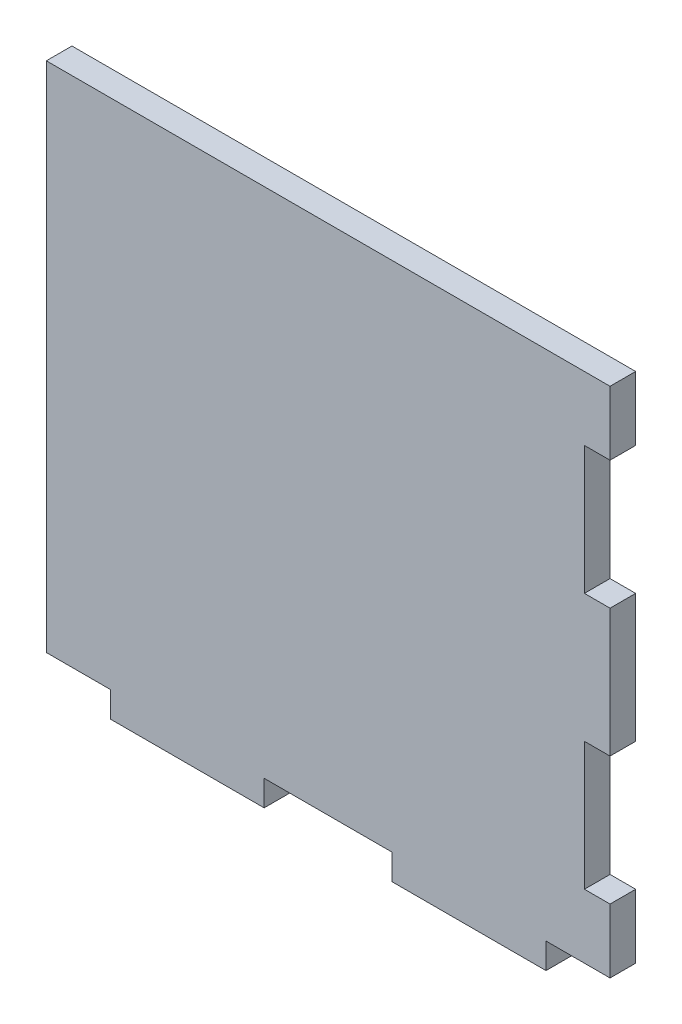
ISO-10303-21;
HEADER;
FILE_DESCRIPTION(('STEP AP214'),'2;1');
FILE_NAME('part.step','',(''),(''),'','','');
FILE_SCHEMA(('AUTOMOTIVE_DESIGN { 1 0 10303 214 1 1 1 1 }'));
ENDSEC;
DATA;
#1=APPLICATION_CONTEXT('core data for automotive mechanical design processes');
#2=APPLICATION_PROTOCOL_DEFINITION('international standard','automotive_design',2000,#1);
#3=PRODUCT_CONTEXT('',#1,'mechanical');
#4=PRODUCT('Part','Part','',(#3));
#5=PRODUCT_RELATED_PRODUCT_CATEGORY('part','',(#4));
#6=PRODUCT_DEFINITION_FORMATION('','',#4);
#7=PRODUCT_DEFINITION_CONTEXT('part definition',#1,'design');
#8=PRODUCT_DEFINITION('design','',#6,#7);
#9=PRODUCT_DEFINITION_SHAPE('','',#8);
#10=(LENGTH_UNIT() NAMED_UNIT(*) SI_UNIT(.MILLI.,.METRE.));
#11=(NAMED_UNIT(*) PLANE_ANGLE_UNIT() SI_UNIT($,.RADIAN.));
#12=(NAMED_UNIT(*) SI_UNIT($,.STERADIAN.) SOLID_ANGLE_UNIT());
#13=UNCERTAINTY_MEASURE_WITH_UNIT(LENGTH_MEASURE(1.E-05),#10,'distance_accuracy_value','');
#14=(GEOMETRIC_REPRESENTATION_CONTEXT(3) GLOBAL_UNCERTAINTY_ASSIGNED_CONTEXT((#13)) GLOBAL_UNIT_ASSIGNED_CONTEXT((#10,
#11,#12)) REPRESENTATION_CONTEXT('',''));
#15=CARTESIAN_POINT('',(0.,0.,0.));
#16=DIRECTION('',(0.,0.,1.));
#17=DIRECTION('',(1.,0.,0.));
#18=AXIS2_PLACEMENT_3D('',#15,#16,#17);
#19=CARTESIAN_POINT('',(110.,0.,5.));
#20=DIRECTION('',(-1.,0.,0.));
#21=DIRECTION('',(0.,0.,1.));
#22=AXIS2_PLACEMENT_3D('',#19,#20,#21);
#23=PLANE('',#22);
#24=DIRECTION('',(0.,1.,0.));
#25=VECTOR('',#24,1.);
#26=CARTESIAN_POINT('',(110.,0.,0.));
#27=LINE('',#26,#25);
#28=CARTESIAN_POINT('',(110.,37.5,0.));
#29=VERTEX_POINT('',#28);
#30=CARTESIAN_POINT('',(110.,62.5,0.));
#31=VERTEX_POINT('',#30);
#32=EDGE_CURVE('E194',#29,#31,#27,.T.);
#33=ORIENTED_EDGE('',*,*,#32,.T.);
#34=DIRECTION('',(0.,0.,1.));
#35=VECTOR('',#34,1.);
#36=CARTESIAN_POINT('',(110.,62.5,0.));
#37=LINE('',#36,#35);
#38=CARTESIAN_POINT('',(110.,62.5,5.));
#39=VERTEX_POINT('',#38);
#40=EDGE_CURVE('E330',#31,#39,#37,.T.);
#41=ORIENTED_EDGE('',*,*,#40,.T.);
#42=DIRECTION('',(0.,1.,0.));
#43=VECTOR('',#42,1.);
#44=CARTESIAN_POINT('',(110.,0.,5.));
#45=LINE('',#44,#43);
#46=CARTESIAN_POINT('',(110.,37.5,5.));
#47=VERTEX_POINT('',#46);
#48=EDGE_CURVE('E328',#47,#39,#45,.T.);
#49=ORIENTED_EDGE('',*,*,#48,.F.);
#50=DIRECTION('',(0.,0.,1.));
#51=VECTOR('',#50,1.);
#52=CARTESIAN_POINT('',(110.,37.5,0.));
#53=LINE('',#52,#51);
#54=EDGE_CURVE('E288',#29,#47,#53,.T.);
#55=ORIENTED_EDGE('',*,*,#54,.F.);
#56=EDGE_LOOP('',(#33,#41,#49,#55));
#57=FACE_BOUND('',#56,.T.);
#58=ADVANCED_FACE('F33',(#57),#23,.F.);
#59=CARTESIAN_POINT('',(110.,0.,0.));
#60=VERTEX_POINT('',#59);
#61=CARTESIAN_POINT('',(110.,12.5,0.));
#62=VERTEX_POINT('',#61);
#63=EDGE_CURVE('E197',#60,#62,#27,.T.);
#64=ORIENTED_EDGE('',*,*,#63,.T.);
#65=DIRECTION('',(0.,0.,1.));
#66=VECTOR('',#65,1.);
#67=CARTESIAN_POINT('',(110.,12.5,0.));
#68=LINE('',#67,#66);
#69=CARTESIAN_POINT('',(110.,12.5,5.));
#70=VERTEX_POINT('',#69);
#71=EDGE_CURVE('E304',#62,#70,#68,.T.);
#72=ORIENTED_EDGE('',*,*,#71,.T.);
#73=CARTESIAN_POINT('',(110.,0.,5.));
#74=VERTEX_POINT('',#73);
#75=EDGE_CURVE('E325',#74,#70,#45,.T.);
#76=ORIENTED_EDGE('',*,*,#75,.F.);
#77=DIRECTION('',(0.,0.,-1.));
#78=VECTOR('',#77,1.);
#79=CARTESIAN_POINT('',(110.,0.,5.));
#80=LINE('',#79,#78);
#81=EDGE_CURVE('E220',#74,#60,#80,.T.);
#82=ORIENTED_EDGE('',*,*,#81,.T.);
#83=EDGE_LOOP('',(#64,#72,#76,#82));
#84=FACE_BOUND('',#83,.T.);
#85=ADVANCED_FACE('F363',(#84),#23,.F.);
#86=CARTESIAN_POINT('',(0.,0.,5.));
#87=DIRECTION('',(1.,0.,0.));
#88=DIRECTION('',(0.,0.,-1.));
#89=AXIS2_PLACEMENT_3D('',#86,#87,#88);
#90=PLANE('',#89);
#91=DIRECTION('',(0.,-1.,0.));
#92=VECTOR('',#91,1.);
#93=CARTESIAN_POINT('',(0.,0.,0.));
#94=LINE('',#93,#92);
#95=CARTESIAN_POINT('',(0.,100.,0.));
#96=VERTEX_POINT('',#95);
#97=CARTESIAN_POINT('',(0.,0.,0.));
#98=VERTEX_POINT('',#97);
#99=EDGE_CURVE('E259',#96,#98,#94,.T.);
#100=ORIENTED_EDGE('',*,*,#99,.T.);
#101=DIRECTION('',(0.,0.,-1.));
#102=VECTOR('',#101,1.);
#103=CARTESIAN_POINT('',(0.,0.,5.));
#104=LINE('',#103,#102);
#105=CARTESIAN_POINT('',(0.,0.,5.));
#106=VERTEX_POINT('',#105);
#107=EDGE_CURVE('E11',#106,#98,#104,.T.);
#108=ORIENTED_EDGE('',*,*,#107,.F.);
#109=DIRECTION('',(0.,-1.,0.));
#110=VECTOR('',#109,1.);
#111=CARTESIAN_POINT('',(0.,0.,5.));
#112=LINE('',#111,#110);
#113=CARTESIAN_POINT('',(0.,100.,5.));
#114=VERTEX_POINT('',#113);
#115=EDGE_CURVE('E207',#114,#106,#112,.T.);
#116=ORIENTED_EDGE('',*,*,#115,.F.);
#117=DIRECTION('',(0.,0.,-1.));
#118=VECTOR('',#117,1.);
#119=CARTESIAN_POINT('',(0.,100.,5.));
#120=LINE('',#119,#118);
#121=EDGE_CURVE('E215',#114,#96,#120,.T.);
#122=ORIENTED_EDGE('',*,*,#121,.T.);
#123=EDGE_LOOP('',(#100,#108,#116,#122));
#124=FACE_BOUND('',#123,.T.);
#125=ADVANCED_FACE('F35',(#124),#90,.F.);
#126=CARTESIAN_POINT('',(0.,0.,5.));
#127=DIRECTION('',(0.,1.,0.));
#128=DIRECTION('',(0.,0.,1.));
#129=AXIS2_PLACEMENT_3D('',#126,#127,#128);
#130=PLANE('',#129);
#131=DIRECTION('',(1.,0.,0.));
#132=VECTOR('',#131,1.);
#133=CARTESIAN_POINT('',(0.,0.,0.));
#134=LINE('',#133,#132);
#135=CARTESIAN_POINT('',(12.5,0.,0.));
#136=VERTEX_POINT('',#135);
#137=EDGE_CURVE('E253',#98,#136,#134,.T.);
#138=ORIENTED_EDGE('',*,*,#137,.T.);
#139=DIRECTION('',(0.,0.,-1.));
#140=VECTOR('',#139,1.);
#141=CARTESIAN_POINT('',(12.5,0.,5.));
#142=LINE('',#141,#140);
#143=CARTESIAN_POINT('',(12.5,0.,5.));
#144=VERTEX_POINT('',#143);
#145=EDGE_CURVE('E41',#144,#136,#142,.T.);
#146=ORIENTED_EDGE('',*,*,#145,.F.);
#147=DIRECTION('',(1.,0.,0.));
#148=VECTOR('',#147,1.);
#149=CARTESIAN_POINT('',(0.,0.,5.));
#150=LINE('',#149,#148);
#151=EDGE_CURVE('E212',#106,#144,#150,.T.);
#152=ORIENTED_EDGE('',*,*,#151,.F.);
#153=ORIENTED_EDGE('',*,*,#107,.T.);
#154=EDGE_LOOP('',(#138,#146,#152,#153));
#155=FACE_BOUND('',#154,.T.);
#156=ADVANCED_FACE('F355',(#155),#130,.F.);
#157=CARTESIAN_POINT('',(12.5,0.,5.));
#158=DIRECTION('',(1.,0.,0.));
#159=DIRECTION('',(0.,0.,-1.));
#160=AXIS2_PLACEMENT_3D('',#157,#158,#159);
#161=PLANE('',#160);
#162=DIRECTION('',(0.,-1.,0.));
#163=VECTOR('',#162,1.);
#164=CARTESIAN_POINT('',(12.5,0.,0.));
#165=LINE('',#164,#163);
#166=CARTESIAN_POINT('',(12.5,-5.,0.));
#167=VERTEX_POINT('',#166);
#168=EDGE_CURVE('E249',#136,#167,#165,.T.);
#169=ORIENTED_EDGE('',*,*,#168,.T.);
#170=DIRECTION('',(0.,0.,-1.));
#171=VECTOR('',#170,1.);
#172=CARTESIAN_POINT('',(12.5,-5.,5.));
#173=LINE('',#172,#171);
#174=CARTESIAN_POINT('',(12.5,-5.,5.));
#175=VERTEX_POINT('',#174);
#176=EDGE_CURVE('E240',#175,#167,#173,.T.);
#177=ORIENTED_EDGE('',*,*,#176,.F.);
#178=DIRECTION('',(0.,-1.,0.));
#179=VECTOR('',#178,1.);
#180=CARTESIAN_POINT('',(12.5,0.,5.));
#181=LINE('',#180,#179);
#182=EDGE_CURVE('E250',#144,#175,#181,.T.);
#183=ORIENTED_EDGE('',*,*,#182,.F.);
#184=ORIENTED_EDGE('',*,*,#145,.T.);
#185=EDGE_LOOP('',(#169,#177,#183,#184));
#186=FACE_BOUND('',#185,.T.);
#187=ADVANCED_FACE('F247',(#186),#161,.F.);
#188=CARTESIAN_POINT('',(12.5,-5.,5.));
#189=DIRECTION('',(0.,1.,0.));
#190=DIRECTION('',(0.,0.,1.));
#191=AXIS2_PLACEMENT_3D('',#188,#189,#190);
#192=PLANE('',#191);
#193=DIRECTION('',(1.,0.,0.));
#194=VECTOR('',#193,1.);
#195=CARTESIAN_POINT('',(12.5,-5.,0.));
#196=LINE('',#195,#194);
#197=CARTESIAN_POINT('',(42.5,-5.,0.));
#198=VERTEX_POINT('',#197);
#199=EDGE_CURVE('E255',#167,#198,#196,.T.);
#200=ORIENTED_EDGE('',*,*,#199,.T.);
#201=DIRECTION('',(0.,0.,-1.));
#202=VECTOR('',#201,1.);
#203=CARTESIAN_POINT('',(42.5,-5.,5.));
#204=LINE('',#203,#202);
#205=CARTESIAN_POINT('',(42.5,-5.,5.));
#206=VERTEX_POINT('',#205);
#207=EDGE_CURVE('E237',#206,#198,#204,.T.);
#208=ORIENTED_EDGE('',*,*,#207,.F.);
#209=DIRECTION('',(1.,0.,0.));
#210=VECTOR('',#209,1.);
#211=CARTESIAN_POINT('',(12.5,-5.,5.));
#212=LINE('',#211,#210);
#213=EDGE_CURVE('E312',#175,#206,#212,.T.);
#214=ORIENTED_EDGE('',*,*,#213,.F.);
#215=ORIENTED_EDGE('',*,*,#176,.T.);
#216=EDGE_LOOP('',(#200,#208,#214,#215));
#217=FACE_BOUND('',#216,.T.);
#218=ADVANCED_FACE('F361',(#217),#192,.F.);
#219=CARTESIAN_POINT('',(42.5,0.,5.));
#220=DIRECTION('',(-1.,0.,0.));
#221=DIRECTION('',(0.,0.,1.));
#222=AXIS2_PLACEMENT_3D('',#219,#220,#221);
#223=PLANE('',#222);
#224=DIRECTION('',(0.,1.,0.));
#225=VECTOR('',#224,1.);
#226=CARTESIAN_POINT('',(42.5,0.,0.));
#227=LINE('',#226,#225);
#228=CARTESIAN_POINT('',(42.5,0.,0.));
#229=VERTEX_POINT('',#228);
#230=EDGE_CURVE('E257',#198,#229,#227,.T.);
#231=ORIENTED_EDGE('',*,*,#230,.T.);
#232=DIRECTION('',(0.,0.,-1.));
#233=VECTOR('',#232,1.);
#234=CARTESIAN_POINT('',(42.5,0.,5.));
#235=LINE('',#234,#233);
#236=CARTESIAN_POINT('',(42.5,0.,5.));
#237=VERTEX_POINT('',#236);
#238=EDGE_CURVE('E234',#237,#229,#235,.T.);
#239=ORIENTED_EDGE('',*,*,#238,.F.);
#240=DIRECTION('',(0.,1.,0.));
#241=VECTOR('',#240,1.);
#242=CARTESIAN_POINT('',(42.5,0.,5.));
#243=LINE('',#242,#241);
#244=EDGE_CURVE('E314',#206,#237,#243,.T.);
#245=ORIENTED_EDGE('',*,*,#244,.F.);
#246=ORIENTED_EDGE('',*,*,#207,.T.);
#247=EDGE_LOOP('',(#231,#239,#245,#246));
#248=FACE_BOUND('',#247,.T.);
#249=ADVANCED_FACE('F392',(#248),#223,.F.);
#250=CARTESIAN_POINT('',(42.5,0.,5.));
#251=DIRECTION('',(0.,1.,0.));
#252=DIRECTION('',(0.,0.,1.));
#253=AXIS2_PLACEMENT_3D('',#250,#251,#252);
#254=PLANE('',#253);
#255=DIRECTION('',(1.,0.,0.));
#256=VECTOR('',#255,1.);
#257=CARTESIAN_POINT('',(42.5,0.,0.));
#258=LINE('',#257,#256);
#259=CARTESIAN_POINT('',(67.5,0.,0.));
#260=VERTEX_POINT('',#259);
#261=EDGE_CURVE('E264',#229,#260,#258,.T.);
#262=ORIENTED_EDGE('',*,*,#261,.T.);
#263=DIRECTION('',(0.,0.,-1.));
#264=VECTOR('',#263,1.);
#265=CARTESIAN_POINT('',(67.5,0.,5.));
#266=LINE('',#265,#264);
#267=CARTESIAN_POINT('',(67.5,0.,5.));
#268=VERTEX_POINT('',#267);
#269=EDGE_CURVE('E231',#268,#260,#266,.T.);
#270=ORIENTED_EDGE('',*,*,#269,.F.);
#271=DIRECTION('',(1.,0.,0.));
#272=VECTOR('',#271,1.);
#273=CARTESIAN_POINT('',(42.5,0.,5.));
#274=LINE('',#273,#272);
#275=EDGE_CURVE('E316',#237,#268,#274,.T.);
#276=ORIENTED_EDGE('',*,*,#275,.F.);
#277=ORIENTED_EDGE('',*,*,#238,.T.);
#278=EDGE_LOOP('',(#262,#270,#276,#277));
#279=FACE_BOUND('',#278,.T.);
#280=ADVANCED_FACE('F388',(#279),#254,.F.);
#281=CARTESIAN_POINT('',(67.5,0.,5.));
#282=DIRECTION('',(1.,0.,0.));
#283=DIRECTION('',(0.,0.,-1.));
#284=AXIS2_PLACEMENT_3D('',#281,#282,#283);
#285=PLANE('',#284);
#286=DIRECTION('',(0.,-1.,0.));
#287=VECTOR('',#286,1.);
#288=CARTESIAN_POINT('',(67.5,0.,0.));
#289=LINE('',#288,#287);
#290=CARTESIAN_POINT('',(67.5,-5.,0.));
#291=VERTEX_POINT('',#290);
#292=EDGE_CURVE('E266',#260,#291,#289,.T.);
#293=ORIENTED_EDGE('',*,*,#292,.T.);
#294=DIRECTION('',(0.,0.,-1.));
#295=VECTOR('',#294,1.);
#296=CARTESIAN_POINT('',(67.5,-5.,5.));
#297=LINE('',#296,#295);
#298=CARTESIAN_POINT('',(67.5,-5.,5.));
#299=VERTEX_POINT('',#298);
#300=EDGE_CURVE('E228',#299,#291,#297,.T.);
#301=ORIENTED_EDGE('',*,*,#300,.F.);
#302=DIRECTION('',(0.,-1.,0.));
#303=VECTOR('',#302,1.);
#304=CARTESIAN_POINT('',(67.5,0.,5.));
#305=LINE('',#304,#303);
#306=EDGE_CURVE('E318',#268,#299,#305,.T.);
#307=ORIENTED_EDGE('',*,*,#306,.F.);
#308=ORIENTED_EDGE('',*,*,#269,.T.);
#309=EDGE_LOOP('',(#293,#301,#307,#308));
#310=FACE_BOUND('',#309,.T.);
#311=ADVANCED_FACE('F384',(#310),#285,.F.);
#312=CARTESIAN_POINT('',(97.5,-4.99999999999999,5.));
#313=DIRECTION('',(0.,1.,0.));
#314=DIRECTION('',(-1.,0.,0.));
#315=AXIS2_PLACEMENT_3D('',#312,#313,#314);
#316=PLANE('',#315);
#317=DIRECTION('',(1.,0.,0.));
#318=VECTOR('',#317,1.);
#319=CARTESIAN_POINT('',(97.5,-4.99999999999999,0.));
#320=LINE('',#319,#318);
#321=CARTESIAN_POINT('',(97.5,-4.99999999999999,0.));
#322=VERTEX_POINT('',#321);
#323=EDGE_CURVE('E268',#291,#322,#320,.T.);
#324=ORIENTED_EDGE('',*,*,#323,.T.);
#325=DIRECTION('',(0.,0.,-1.));
#326=VECTOR('',#325,1.);
#327=CARTESIAN_POINT('',(97.5,-4.99999999999999,5.));
#328=LINE('',#327,#326);
#329=CARTESIAN_POINT('',(97.5,-4.99999999999999,5.));
#330=VERTEX_POINT('',#329);
#331=EDGE_CURVE('E225',#330,#322,#328,.T.);
#332=ORIENTED_EDGE('',*,*,#331,.F.);
#333=DIRECTION('',(1.,0.,0.));
#334=VECTOR('',#333,1.);
#335=CARTESIAN_POINT('',(97.5,-4.99999999999999,5.));
#336=LINE('',#335,#334);
#337=EDGE_CURVE('E320',#299,#330,#336,.T.);
#338=ORIENTED_EDGE('',*,*,#337,.F.);
#339=ORIENTED_EDGE('',*,*,#300,.T.);
#340=EDGE_LOOP('',(#324,#332,#338,#339));
#341=FACE_BOUND('',#340,.T.);
#342=ADVANCED_FACE('F379',(#341),#316,.F.);
#343=CARTESIAN_POINT('',(97.5,0.,5.));
#344=DIRECTION('',(-1.,0.,0.));
#345=DIRECTION('',(0.,-1.,0.));
#346=AXIS2_PLACEMENT_3D('',#343,#344,#345);
#347=PLANE('',#346);
#348=DIRECTION('',(0.,1.,0.));
#349=VECTOR('',#348,1.);
#350=CARTESIAN_POINT('',(97.5,0.,0.));
#351=LINE('',#350,#349);
#352=CARTESIAN_POINT('',(97.5,0.,0.));
#353=VERTEX_POINT('',#352);
#354=EDGE_CURVE('E199',#322,#353,#351,.T.);
#355=ORIENTED_EDGE('',*,*,#354,.T.);
#356=DIRECTION('',(0.,0.,-1.));
#357=VECTOR('',#356,1.);
#358=CARTESIAN_POINT('',(97.5,0.,5.));
#359=LINE('',#358,#357);
#360=CARTESIAN_POINT('',(97.5,0.,5.));
#361=VERTEX_POINT('',#360);
#362=EDGE_CURVE('E222',#361,#353,#359,.T.);
#363=ORIENTED_EDGE('',*,*,#362,.F.);
#364=DIRECTION('',(0.,1.,0.));
#365=VECTOR('',#364,1.);
#366=CARTESIAN_POINT('',(97.5,0.,5.));
#367=LINE('',#366,#365);
#368=EDGE_CURVE('E322',#330,#361,#367,.T.);
#369=ORIENTED_EDGE('',*,*,#368,.F.);
#370=ORIENTED_EDGE('',*,*,#331,.T.);
#371=EDGE_LOOP('',(#355,#363,#369,#370));
#372=FACE_BOUND('',#371,.T.);
#373=ADVANCED_FACE('F273',(#372),#347,.F.);
#374=CARTESIAN_POINT('',(97.5,0.,5.));
#375=DIRECTION('',(0.,1.,0.));
#376=DIRECTION('',(0.,0.,1.));
#377=AXIS2_PLACEMENT_3D('',#374,#375,#376);
#378=PLANE('',#377);
#379=DIRECTION('',(1.,0.,0.));
#380=VECTOR('',#379,1.);
#381=CARTESIAN_POINT('',(97.5,0.,0.));
#382=LINE('',#381,#380);
#383=EDGE_CURVE('E195',#353,#60,#382,.T.);
#384=ORIENTED_EDGE('',*,*,#383,.T.);
#385=ORIENTED_EDGE('',*,*,#81,.F.);
#386=DIRECTION('',(1.,0.,0.));
#387=VECTOR('',#386,1.);
#388=CARTESIAN_POINT('',(97.5,0.,5.));
#389=LINE('',#388,#387);
#390=EDGE_CURVE('E282',#361,#74,#389,.T.);
#391=ORIENTED_EDGE('',*,*,#390,.F.);
#392=ORIENTED_EDGE('',*,*,#362,.T.);
#393=EDGE_LOOP('',(#384,#385,#391,#392));
#394=FACE_BOUND('',#393,.T.);
#395=ADVANCED_FACE('F280',(#394),#378,.F.);
#396=CARTESIAN_POINT('',(110.,87.5,5.));
#397=VERTEX_POINT('',#396);
#398=CARTESIAN_POINT('',(110.,100.,5.));
#399=VERTEX_POINT('',#398);
#400=EDGE_CURVE('E186',#397,#399,#45,.T.);
#401=ORIENTED_EDGE('',*,*,#400,.F.);
#402=DIRECTION('',(0.,0.,1.));
#403=VECTOR('',#402,1.);
#404=CARTESIAN_POINT('',(110.,87.5,0.));
#405=LINE('',#404,#403);
#406=CARTESIAN_POINT('',(110.,87.5,0.));
#407=VERTEX_POINT('',#406);
#408=EDGE_CURVE('E173',#407,#397,#405,.T.);
#409=ORIENTED_EDGE('',*,*,#408,.F.);
#410=CARTESIAN_POINT('',(110.,100.,0.));
#411=VERTEX_POINT('',#410);
#412=EDGE_CURVE('E184',#407,#411,#27,.T.);
#413=ORIENTED_EDGE('',*,*,#412,.T.);
#414=DIRECTION('',(0.,0.,-1.));
#415=VECTOR('',#414,1.);
#416=CARTESIAN_POINT('',(110.,100.,5.));
#417=LINE('',#416,#415);
#418=EDGE_CURVE('E217',#399,#411,#417,.T.);
#419=ORIENTED_EDGE('',*,*,#418,.F.);
#420=EDGE_LOOP('',(#401,#409,#413,#419));
#421=FACE_BOUND('',#420,.T.);
#422=ADVANCED_FACE('F182',(#421),#23,.F.);
#423=CARTESIAN_POINT('',(0.,100.,5.));
#424=DIRECTION('',(0.,-1.,0.));
#425=DIRECTION('',(0.,0.,-1.));
#426=AXIS2_PLACEMENT_3D('',#423,#424,#425);
#427=PLANE('',#426);
#428=DIRECTION('',(-1.,0.,0.));
#429=VECTOR('',#428,1.);
#430=CARTESIAN_POINT('',(0.,100.,0.));
#431=LINE('',#430,#429);
#432=EDGE_CURVE('E193',#411,#96,#431,.T.);
#433=ORIENTED_EDGE('',*,*,#432,.T.);
#434=ORIENTED_EDGE('',*,*,#121,.F.);
#435=DIRECTION('',(-1.,0.,0.));
#436=VECTOR('',#435,1.);
#437=CARTESIAN_POINT('',(0.,100.,5.));
#438=LINE('',#437,#436);
#439=EDGE_CURVE('E218',#399,#114,#438,.T.);
#440=ORIENTED_EDGE('',*,*,#439,.F.);
#441=ORIENTED_EDGE('',*,*,#418,.T.);
#442=EDGE_LOOP('',(#433,#434,#440,#441));
#443=FACE_BOUND('',#442,.T.);
#444=ADVANCED_FACE('F353',(#443),#427,.F.);
#445=CARTESIAN_POINT('',(0.,0.,5.));
#446=DIRECTION('',(0.,0.,-1.));
#447=DIRECTION('',(-1.,0.,0.));
#448=AXIS2_PLACEMENT_3D('',#445,#446,#447);
#449=PLANE('',#448);
#450=ORIENTED_EDGE('',*,*,#48,.T.);
#451=DIRECTION('',(1.,0.,0.));
#452=VECTOR('',#451,1.);
#453=CARTESIAN_POINT('',(110.,62.5,5.));
#454=LINE('',#453,#452);
#455=CARTESIAN_POINT('',(105.,62.5,5.));
#456=VERTEX_POINT('',#455);
#457=EDGE_CURVE('E178',#456,#39,#454,.T.);
#458=ORIENTED_EDGE('',*,*,#457,.F.);
#459=DIRECTION('',(0.,-1.,0.));
#460=VECTOR('',#459,1.);
#461=CARTESIAN_POINT('',(105.,87.5,5.));
#462=LINE('',#461,#460);
#463=CARTESIAN_POINT('',(105.,87.5,5.));
#464=VERTEX_POINT('',#463);
#465=EDGE_CURVE('E480',#464,#456,#462,.T.);
#466=ORIENTED_EDGE('',*,*,#465,.F.);
#467=DIRECTION('',(-1.,0.,0.));
#468=VECTOR('',#467,1.);
#469=CARTESIAN_POINT('',(110.,87.5,5.));
#470=LINE('',#469,#468);
#471=EDGE_CURVE('E306',#397,#464,#470,.T.);
#472=ORIENTED_EDGE('',*,*,#471,.F.);
#473=ORIENTED_EDGE('',*,*,#400,.T.);
#474=ORIENTED_EDGE('',*,*,#439,.T.);
#475=ORIENTED_EDGE('',*,*,#115,.T.);
#476=ORIENTED_EDGE('',*,*,#151,.T.);
#477=ORIENTED_EDGE('',*,*,#182,.T.);
#478=ORIENTED_EDGE('',*,*,#213,.T.);
#479=ORIENTED_EDGE('',*,*,#244,.T.);
#480=ORIENTED_EDGE('',*,*,#275,.T.);
#481=ORIENTED_EDGE('',*,*,#306,.T.);
#482=ORIENTED_EDGE('',*,*,#337,.T.);
#483=ORIENTED_EDGE('',*,*,#368,.T.);
#484=ORIENTED_EDGE('',*,*,#390,.T.);
#485=ORIENTED_EDGE('',*,*,#75,.T.);
#486=DIRECTION('',(1.,0.,0.));
#487=VECTOR('',#486,1.);
#488=CARTESIAN_POINT('',(110.,12.5,5.));
#489=LINE('',#488,#487);
#490=CARTESIAN_POINT('',(105.,12.5,5.));
#491=VERTEX_POINT('',#490);
#492=EDGE_CURVE('E302',#491,#70,#489,.T.);
#493=ORIENTED_EDGE('',*,*,#492,.F.);
#494=DIRECTION('',(0.,-1.,0.));
#495=VECTOR('',#494,1.);
#496=CARTESIAN_POINT('',(105.,12.5,5.));
#497=LINE('',#496,#495);
#498=CARTESIAN_POINT('',(105.,37.5,5.));
#499=VERTEX_POINT('',#498);
#500=EDGE_CURVE('E299',#499,#491,#497,.T.);
#501=ORIENTED_EDGE('',*,*,#500,.F.);
#502=DIRECTION('',(-1.,0.,0.));
#503=VECTOR('',#502,1.);
#504=CARTESIAN_POINT('',(110.,37.5,5.));
#505=LINE('',#504,#503);
#506=EDGE_CURVE('E296',#47,#499,#505,.T.);
#507=ORIENTED_EDGE('',*,*,#506,.F.);
#508=EDGE_LOOP('',(#450,#458,#466,#472,#473,#474,#475,#476,#477,#478,#479,#480,#481,#482,#483,
#484,#485,#493,#501,#507));
#509=FACE_BOUND('',#508,.T.);
#510=ADVANCED_FACE('F350',(#509),#449,.F.);
#511=CARTESIAN_POINT('',(0.,0.,0.));
#512=DIRECTION('',(0.,0.,-1.));
#513=DIRECTION('',(-1.,0.,0.));
#514=AXIS2_PLACEMENT_3D('',#511,#512,#513);
#515=PLANE('',#514);
#516=DIRECTION('',(1.,0.,0.));
#517=VECTOR('',#516,1.);
#518=CARTESIAN_POINT('',(110.,62.5,0.));
#519=LINE('',#518,#517);
#520=CARTESIAN_POINT('',(105.,62.5,0.));
#521=VERTEX_POINT('',#520);
#522=EDGE_CURVE('E187',#521,#31,#519,.T.);
#523=ORIENTED_EDGE('',*,*,#522,.T.);
#524=ORIENTED_EDGE('',*,*,#32,.F.);
#525=DIRECTION('',(-1.,0.,0.));
#526=VECTOR('',#525,1.);
#527=CARTESIAN_POINT('',(110.,37.5,0.));
#528=LINE('',#527,#526);
#529=CARTESIAN_POINT('',(105.,37.5,0.));
#530=VERTEX_POINT('',#529);
#531=EDGE_CURVE('E292',#29,#530,#528,.T.);
#532=ORIENTED_EDGE('',*,*,#531,.T.);
#533=DIRECTION('',(0.,-1.,0.));
#534=VECTOR('',#533,1.);
#535=CARTESIAN_POINT('',(105.,12.5,0.));
#536=LINE('',#535,#534);
#537=CARTESIAN_POINT('',(105.,12.5,0.));
#538=VERTEX_POINT('',#537);
#539=EDGE_CURVE('E56',#530,#538,#536,.T.);
#540=ORIENTED_EDGE('',*,*,#539,.T.);
#541=DIRECTION('',(1.,0.,0.));
#542=VECTOR('',#541,1.);
#543=CARTESIAN_POINT('',(110.,12.5,0.));
#544=LINE('',#543,#542);
#545=EDGE_CURVE('E285',#538,#62,#544,.T.);
#546=ORIENTED_EDGE('',*,*,#545,.T.);
#547=ORIENTED_EDGE('',*,*,#63,.F.);
#548=ORIENTED_EDGE('',*,*,#383,.F.);
#549=ORIENTED_EDGE('',*,*,#354,.F.);
#550=ORIENTED_EDGE('',*,*,#323,.F.);
#551=ORIENTED_EDGE('',*,*,#292,.F.);
#552=ORIENTED_EDGE('',*,*,#261,.F.);
#553=ORIENTED_EDGE('',*,*,#230,.F.);
#554=ORIENTED_EDGE('',*,*,#199,.F.);
#555=ORIENTED_EDGE('',*,*,#168,.F.);
#556=ORIENTED_EDGE('',*,*,#137,.F.);
#557=ORIENTED_EDGE('',*,*,#99,.F.);
#558=ORIENTED_EDGE('',*,*,#432,.F.);
#559=ORIENTED_EDGE('',*,*,#412,.F.);
#560=DIRECTION('',(-1.,0.,0.));
#561=VECTOR('',#560,1.);
#562=CARTESIAN_POINT('',(110.,87.5,0.));
#563=LINE('',#562,#561);
#564=CARTESIAN_POINT('',(105.,87.5,0.));
#565=VERTEX_POINT('',#564);
#566=EDGE_CURVE('E169',#407,#565,#563,.T.);
#567=ORIENTED_EDGE('',*,*,#566,.T.);
#568=DIRECTION('',(0.,-1.,0.));
#569=VECTOR('',#568,1.);
#570=CARTESIAN_POINT('',(105.,87.5,0.));
#571=LINE('',#570,#569);
#572=EDGE_CURVE('E48',#565,#521,#571,.T.);
#573=ORIENTED_EDGE('',*,*,#572,.T.);
#574=EDGE_LOOP('',(#523,#524,#532,#540,#546,#547,#548,#549,#550,#551,#552,#553,#554,#555,#556,
#557,#558,#559,#567,#573));
#575=FACE_BOUND('',#574,.T.);
#576=ADVANCED_FACE('F191',(#575),#515,.T.);
#577=CARTESIAN_POINT('',(110.,12.5,0.));
#578=DIRECTION('',(0.,-1.,0.));
#579=DIRECTION('',(0.,0.,-1.));
#580=AXIS2_PLACEMENT_3D('',#577,#578,#579);
#581=PLANE('',#580);
#582=ORIENTED_EDGE('',*,*,#492,.T.);
#583=ORIENTED_EDGE('',*,*,#71,.F.);
#584=ORIENTED_EDGE('',*,*,#545,.F.);
#585=DIRECTION('',(0.,0.,1.));
#586=VECTOR('',#585,1.);
#587=CARTESIAN_POINT('',(105.,12.5,0.));
#588=LINE('',#587,#586);
#589=EDGE_CURVE('E307',#538,#491,#588,.T.);
#590=ORIENTED_EDGE('',*,*,#589,.T.);
#591=EDGE_LOOP('',(#582,#583,#584,#590));
#592=FACE_BOUND('',#591,.T.);
#593=ADVANCED_FACE('F414',(#592),#581,.F.);
#594=CARTESIAN_POINT('',(105.,12.5,0.));
#595=DIRECTION('',(-1.,0.,0.));
#596=DIRECTION('',(0.,0.,1.));
#597=AXIS2_PLACEMENT_3D('',#594,#595,#596);
#598=PLANE('',#597);
#599=ORIENTED_EDGE('',*,*,#500,.T.);
#600=ORIENTED_EDGE('',*,*,#589,.F.);
#601=ORIENTED_EDGE('',*,*,#539,.F.);
#602=DIRECTION('',(0.,0.,1.));
#603=VECTOR('',#602,1.);
#604=CARTESIAN_POINT('',(105.,37.5,0.));
#605=LINE('',#604,#603);
#606=EDGE_CURVE('E290',#530,#499,#605,.T.);
#607=ORIENTED_EDGE('',*,*,#606,.T.);
#608=EDGE_LOOP('',(#599,#600,#601,#607));
#609=FACE_BOUND('',#608,.T.);
#610=ADVANCED_FACE('F416',(#609),#598,.F.);
#611=CARTESIAN_POINT('',(110.,37.5,0.));
#612=DIRECTION('',(0.,1.,0.));
#613=DIRECTION('',(0.,0.,1.));
#614=AXIS2_PLACEMENT_3D('',#611,#612,#613);
#615=PLANE('',#614);
#616=ORIENTED_EDGE('',*,*,#506,.T.);
#617=ORIENTED_EDGE('',*,*,#606,.F.);
#618=ORIENTED_EDGE('',*,*,#531,.F.);
#619=ORIENTED_EDGE('',*,*,#54,.T.);
#620=EDGE_LOOP('',(#616,#617,#618,#619));
#621=FACE_BOUND('',#620,.T.);
#622=ADVANCED_FACE('F346',(#621),#615,.F.);
#623=CARTESIAN_POINT('',(110.,62.5,0.));
#624=DIRECTION('',(0.,-1.,0.));
#625=DIRECTION('',(0.,0.,-1.));
#626=AXIS2_PLACEMENT_3D('',#623,#624,#625);
#627=PLANE('',#626);
#628=ORIENTED_EDGE('',*,*,#457,.T.);
#629=ORIENTED_EDGE('',*,*,#40,.F.);
#630=ORIENTED_EDGE('',*,*,#522,.F.);
#631=DIRECTION('',(0.,0.,1.));
#632=VECTOR('',#631,1.);
#633=CARTESIAN_POINT('',(105.,62.5,0.));
#634=LINE('',#633,#632);
#635=EDGE_CURVE('E334',#521,#456,#634,.T.);
#636=ORIENTED_EDGE('',*,*,#635,.T.);
#637=EDGE_LOOP('',(#628,#629,#630,#636));
#638=FACE_BOUND('',#637,.T.);
#639=ADVANCED_FACE('F423',(#638),#627,.F.);
#640=CARTESIAN_POINT('',(105.,87.5,0.));
#641=DIRECTION('',(-1.,0.,0.));
#642=DIRECTION('',(0.,0.,1.));
#643=AXIS2_PLACEMENT_3D('',#640,#641,#642);
#644=PLANE('',#643);
#645=ORIENTED_EDGE('',*,*,#465,.T.);
#646=ORIENTED_EDGE('',*,*,#635,.F.);
#647=ORIENTED_EDGE('',*,*,#572,.F.);
#648=DIRECTION('',(0.,0.,1.));
#649=VECTOR('',#648,1.);
#650=CARTESIAN_POINT('',(105.,87.5,0.));
#651=LINE('',#650,#649);
#652=EDGE_CURVE('E175',#565,#464,#651,.T.);
#653=ORIENTED_EDGE('',*,*,#652,.T.);
#654=EDGE_LOOP('',(#645,#646,#647,#653));
#655=FACE_BOUND('',#654,.T.);
#656=ADVANCED_FACE('F459',(#655),#644,.F.);
#657=CARTESIAN_POINT('',(110.,87.5,0.));
#658=DIRECTION('',(0.,1.,0.));
#659=DIRECTION('',(0.,0.,1.));
#660=AXIS2_PLACEMENT_3D('',#657,#658,#659);
#661=PLANE('',#660);
#662=ORIENTED_EDGE('',*,*,#471,.T.);
#663=ORIENTED_EDGE('',*,*,#652,.F.);
#664=ORIENTED_EDGE('',*,*,#566,.F.);
#665=ORIENTED_EDGE('',*,*,#408,.T.);
#666=EDGE_LOOP('',(#662,#663,#664,#665));
#667=FACE_BOUND('',#666,.T.);
#668=ADVANCED_FACE('F172',(#667),#661,.F.);
#669=CLOSED_SHELL('',(#58,#85,#125,#156,#187,#218,#249,#280,#311,#342,#373,#395,#422,#444,#510,
#576,#593,#610,#622,#639,#656,#668));
#670=MANIFOLD_SOLID_BREP('B2',#669);
#671=ADVANCED_BREP_SHAPE_REPRESENTATION('',(#18,#670),#14);
#672=SHAPE_DEFINITION_REPRESENTATION(#9,#671);
ENDSEC;
END-ISO-10303-21;
